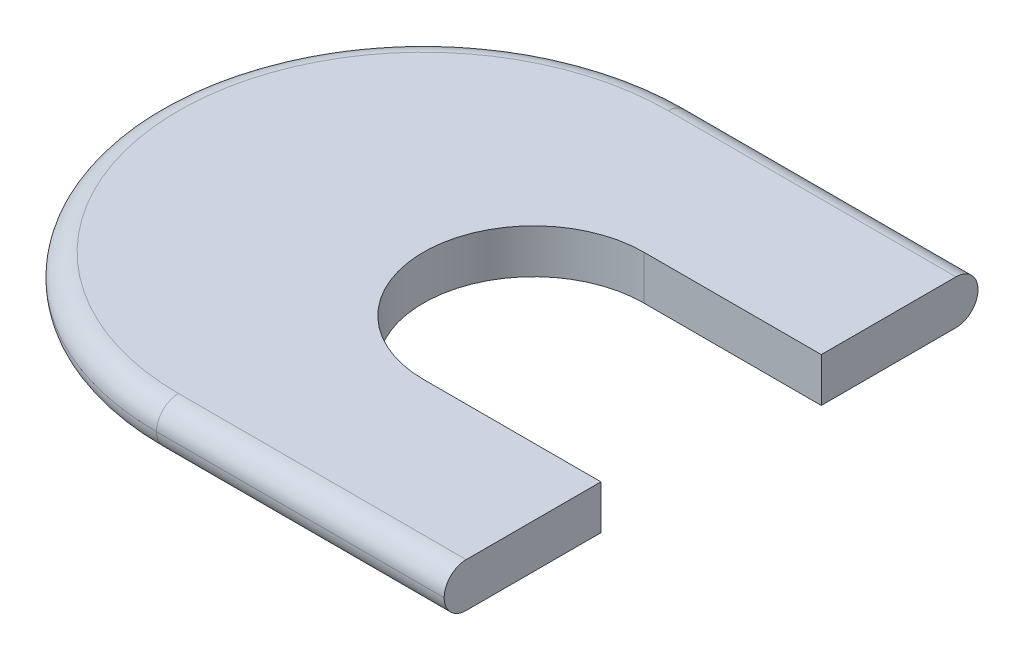
ISO-10303-21;
HEADER;
FILE_DESCRIPTION(('STEP AP214'),'2;1');
FILE_NAME('part.step','',(''),(''),'','','');
FILE_SCHEMA(('AUTOMOTIVE_DESIGN { 1 0 10303 214 1 1 1 1 }'));
ENDSEC;
DATA;
#1=APPLICATION_CONTEXT('core data for automotive mechanical design processes');
#2=APPLICATION_PROTOCOL_DEFINITION('international standard','automotive_design',2000,#1);
#3=PRODUCT_CONTEXT('',#1,'mechanical');
#4=PRODUCT('Part','Part','',(#3));
#5=PRODUCT_RELATED_PRODUCT_CATEGORY('part','',(#4));
#6=PRODUCT_DEFINITION_FORMATION('','',#4);
#7=PRODUCT_DEFINITION_CONTEXT('part definition',#1,'design');
#8=PRODUCT_DEFINITION('design','',#6,#7);
#9=PRODUCT_DEFINITION_SHAPE('','',#8);
#10=(LENGTH_UNIT() NAMED_UNIT(*) SI_UNIT(.MILLI.,.METRE.));
#11=(NAMED_UNIT(*) PLANE_ANGLE_UNIT() SI_UNIT($,.RADIAN.));
#12=(NAMED_UNIT(*) SI_UNIT($,.STERADIAN.) SOLID_ANGLE_UNIT());
#13=UNCERTAINTY_MEASURE_WITH_UNIT(LENGTH_MEASURE(1.E-05),#10,'distance_accuracy_value','');
#14=(GEOMETRIC_REPRESENTATION_CONTEXT(3) GLOBAL_UNCERTAINTY_ASSIGNED_CONTEXT((#13)) GLOBAL_UNIT_ASSIGNED_CONTEXT((#10,
#11,#12)) REPRESENTATION_CONTEXT('',''));
#15=CARTESIAN_POINT('',(0.,0.,0.));
#16=DIRECTION('',(0.,0.,1.));
#17=DIRECTION('',(1.,0.,0.));
#18=AXIS2_PLACEMENT_3D('',#15,#16,#17);
#19=CARTESIAN_POINT('',(0.,1.,0.));
#20=DIRECTION('',(0.,-1.,0.));
#21=DIRECTION('',(0.,0.,-1.));
#22=AXIS2_PLACEMENT_3D('',#19,#20,#21);
#23=CYLINDRICAL_SURFACE('',#22,2.5);
#24=CARTESIAN_POINT('',(0.,0.,0.));
#25=DIRECTION('',(0.,-1.,0.));
#26=DIRECTION('',(0.,0.,1.));
#27=AXIS2_PLACEMENT_3D('',#24,#25,#26);
#28=CIRCLE('',#27,2.5);
#29=CARTESIAN_POINT('',(0.,0.,2.5));
#30=VERTEX_POINT('',#29);
#31=CARTESIAN_POINT('',(0.,0.,-2.5));
#32=VERTEX_POINT('',#31);
#33=EDGE_CURVE('E183',#30,#32,#28,.T.);
#34=ORIENTED_EDGE('',*,*,#33,.T.);
#35=DIRECTION('',(0.,-1.,0.));
#36=VECTOR('',#35,1.);
#37=CARTESIAN_POINT('',(0.,1.,-2.5));
#38=LINE('',#37,#36);
#39=CARTESIAN_POINT('',(0.,1.,-2.5));
#40=VERTEX_POINT('',#39);
#41=EDGE_CURVE('E218',#40,#32,#38,.T.);
#42=ORIENTED_EDGE('',*,*,#41,.F.);
#43=CARTESIAN_POINT('',(0.,1.,0.));
#44=DIRECTION('',(0.,-1.,0.));
#45=DIRECTION('',(0.,0.,1.));
#46=AXIS2_PLACEMENT_3D('',#43,#44,#45);
#47=CIRCLE('',#46,2.5);
#48=CARTESIAN_POINT('',(0.,1.,2.5));
#49=VERTEX_POINT('',#48);
#50=EDGE_CURVE('E206',#49,#40,#47,.T.);
#51=ORIENTED_EDGE('',*,*,#50,.F.);
#52=DIRECTION('',(0.,-1.,0.));
#53=VECTOR('',#52,1.);
#54=CARTESIAN_POINT('',(0.,1.,2.5));
#55=LINE('',#54,#53);
#56=EDGE_CURVE('E207',#49,#30,#55,.T.);
#57=ORIENTED_EDGE('',*,*,#56,.T.);
#58=EDGE_LOOP('',(#34,#42,#51,#57));
#59=FACE_BOUND('',#58,.T.);
#60=ADVANCED_FACE('F42',(#59),#23,.F.);
#61=CARTESIAN_POINT('',(0.,1.,-2.5));
#62=DIRECTION('',(0.,0.,-1.));
#63=DIRECTION('',(-1.,0.,0.));
#64=AXIS2_PLACEMENT_3D('',#61,#62,#63);
#65=PLANE('',#64);
#66=DIRECTION('',(1.,0.,0.));
#67=VECTOR('',#66,1.);
#68=CARTESIAN_POINT('',(0.,0.,-2.5));
#69=LINE('',#68,#67);
#70=CARTESIAN_POINT('',(4.02649188596562,0.,-2.5));
#71=VERTEX_POINT('',#70);
#72=EDGE_CURVE('E86',#32,#71,#69,.T.);
#73=ORIENTED_EDGE('',*,*,#72,.T.);
#74=DIRECTION('',(0.,-1.,0.));
#75=VECTOR('',#74,1.);
#76=CARTESIAN_POINT('',(4.02649188596562,1.,-2.5));
#77=LINE('',#76,#75);
#78=CARTESIAN_POINT('',(4.02649188596562,1.,-2.5));
#79=VERTEX_POINT('',#78);
#80=EDGE_CURVE('E214',#79,#71,#77,.T.);
#81=ORIENTED_EDGE('',*,*,#80,.F.);
#82=DIRECTION('',(1.,0.,0.));
#83=VECTOR('',#82,1.);
#84=CARTESIAN_POINT('',(0.,1.,-2.5));
#85=LINE('',#84,#83);
#86=EDGE_CURVE('E248',#40,#79,#85,.T.);
#87=ORIENTED_EDGE('',*,*,#86,.F.);
#88=ORIENTED_EDGE('',*,*,#41,.T.);
#89=EDGE_LOOP('',(#73,#81,#87,#88));
#90=FACE_BOUND('',#89,.T.);
#91=ADVANCED_FACE('F260',(#90),#65,.F.);
#92=CARTESIAN_POINT('',(4.02649188596562,1.,-2.5));
#93=DIRECTION('',(-1.,0.,0.));
#94=DIRECTION('',(0.,0.,1.));
#95=AXIS2_PLACEMENT_3D('',#92,#93,#94);
#96=PLANE('',#95);
#97=DIRECTION('',(0.,0.,-1.));
#98=VECTOR('',#97,1.);
#99=CARTESIAN_POINT('',(4.02649188596562,0.,-2.5));
#100=LINE('',#99,#98);
#101=CARTESIAN_POINT('',(4.02649188596562,0.,-5.55571493406809));
#102=VERTEX_POINT('',#101);
#103=EDGE_CURVE('E191',#71,#102,#100,.T.);
#104=ORIENTED_EDGE('',*,*,#103,.T.);
#105=CARTESIAN_POINT('',(4.02649188596562,0.5,-5.55571493406809));
#106=DIRECTION('',(-1.,0.,0.));
#107=DIRECTION('',(0.,0.,1.));
#108=AXIS2_PLACEMENT_3D('',#105,#106,#107);
#109=CIRCLE('',#108,0.5);
#110=CARTESIAN_POINT('',(4.02649188596562,0.5,-6.0557149340681));
#111=VERTEX_POINT('',#110);
#112=EDGE_CURVE('E132',#102,#111,#109,.F.);
#113=ORIENTED_EDGE('',*,*,#112,.T.);
#114=CARTESIAN_POINT('',(4.02649188596562,0.5,-5.55571493406809));
#115=DIRECTION('',(-1.,0.,0.));
#116=DIRECTION('',(0.,0.,1.));
#117=AXIS2_PLACEMENT_3D('',#114,#115,#116);
#118=CIRCLE('',#117,0.5);
#119=CARTESIAN_POINT('',(4.02649188596562,1.,-5.55571493406809));
#120=VERTEX_POINT('',#119);
#121=EDGE_CURVE('E170',#111,#120,#118,.F.);
#122=ORIENTED_EDGE('',*,*,#121,.T.);
#123=DIRECTION('',(0.,0.,-1.));
#124=VECTOR('',#123,1.);
#125=CARTESIAN_POINT('',(4.02649188596562,1.,-2.5));
#126=LINE('',#125,#124);
#127=EDGE_CURVE('E246',#79,#120,#126,.T.);
#128=ORIENTED_EDGE('',*,*,#127,.F.);
#129=ORIENTED_EDGE('',*,*,#80,.T.);
#130=EDGE_LOOP('',(#104,#113,#122,#128,#129));
#131=FACE_BOUND('',#130,.T.);
#132=ADVANCED_FACE('F230',(#131),#96,.F.);
#133=CARTESIAN_POINT('',(4.02649188596562,1.,2.5));
#134=DIRECTION('',(-1.,0.,0.));
#135=DIRECTION('',(0.,0.,1.));
#136=AXIS2_PLACEMENT_3D('',#133,#134,#135);
#137=PLANE('',#136);
#138=CARTESIAN_POINT('',(4.02649188596562,0.5,5.55571493406809));
#139=DIRECTION('',(-1.,0.,0.));
#140=DIRECTION('',(0.,0.,1.));
#141=AXIS2_PLACEMENT_3D('',#138,#139,#140);
#142=CIRCLE('',#141,0.5);
#143=CARTESIAN_POINT('',(4.02649188596562,1.,5.55571493406809));
#144=VERTEX_POINT('',#143);
#145=CARTESIAN_POINT('',(4.02649188596562,0.5,6.0557149340681));
#146=VERTEX_POINT('',#145);
#147=EDGE_CURVE('E123',#144,#146,#142,.F.);
#148=ORIENTED_EDGE('',*,*,#147,.T.);
#149=CARTESIAN_POINT('',(4.02649188596562,0.5,5.55571493406809));
#150=DIRECTION('',(-1.,0.,0.));
#151=DIRECTION('',(0.,0.,1.));
#152=AXIS2_PLACEMENT_3D('',#149,#150,#151);
#153=CIRCLE('',#152,0.5);
#154=CARTESIAN_POINT('',(4.02649188596562,0.,5.55571493406809));
#155=VERTEX_POINT('',#154);
#156=EDGE_CURVE('E126',#146,#155,#153,.F.);
#157=ORIENTED_EDGE('',*,*,#156,.T.);
#158=DIRECTION('',(0.,0.,-1.));
#159=VECTOR('',#158,1.);
#160=CARTESIAN_POINT('',(4.02649188596562,0.,2.5));
#161=LINE('',#160,#159);
#162=CARTESIAN_POINT('',(4.02649188596562,0.,2.5));
#163=VERTEX_POINT('',#162);
#164=EDGE_CURVE('E200',#155,#163,#161,.T.);
#165=ORIENTED_EDGE('',*,*,#164,.T.);
#166=DIRECTION('',(0.,-1.,0.));
#167=VECTOR('',#166,1.);
#168=CARTESIAN_POINT('',(4.02649188596562,1.,2.5));
#169=LINE('',#168,#167);
#170=CARTESIAN_POINT('',(4.02649188596562,1.,2.5));
#171=VERTEX_POINT('',#170);
#172=EDGE_CURVE('E210',#171,#163,#169,.T.);
#173=ORIENTED_EDGE('',*,*,#172,.F.);
#174=DIRECTION('',(0.,0.,-1.));
#175=VECTOR('',#174,1.);
#176=CARTESIAN_POINT('',(4.02649188596562,1.,2.5));
#177=LINE('',#176,#175);
#178=EDGE_CURVE('E130',#144,#171,#177,.T.);
#179=ORIENTED_EDGE('',*,*,#178,.F.);
#180=EDGE_LOOP('',(#148,#157,#165,#173,#179));
#181=FACE_BOUND('',#180,.T.);
#182=ADVANCED_FACE('F124',(#181),#137,.F.);
#183=CARTESIAN_POINT('',(0.,1.,2.5));
#184=DIRECTION('',(0.,0.,1.));
#185=DIRECTION('',(1.,0.,0.));
#186=AXIS2_PLACEMENT_3D('',#183,#184,#185);
#187=PLANE('',#186);
#188=DIRECTION('',(-1.,0.,0.));
#189=VECTOR('',#188,1.);
#190=CARTESIAN_POINT('',(0.,0.,2.5));
#191=LINE('',#190,#189);
#192=EDGE_CURVE('E203',#163,#30,#191,.T.);
#193=ORIENTED_EDGE('',*,*,#192,.T.);
#194=ORIENTED_EDGE('',*,*,#56,.F.);
#195=DIRECTION('',(-1.,0.,0.));
#196=VECTOR('',#195,1.);
#197=CARTESIAN_POINT('',(0.,1.,2.5));
#198=LINE('',#197,#196);
#199=EDGE_CURVE('E194',#171,#49,#198,.T.);
#200=ORIENTED_EDGE('',*,*,#199,.F.);
#201=ORIENTED_EDGE('',*,*,#172,.T.);
#202=EDGE_LOOP('',(#193,#194,#200,#201));
#203=FACE_BOUND('',#202,.T.);
#204=ADVANCED_FACE('F238',(#203),#187,.F.);
#205=CARTESIAN_POINT('',(0.,1.,0.));
#206=DIRECTION('',(0.,1.,0.));
#207=DIRECTION('',(0.,0.,1.));
#208=AXIS2_PLACEMENT_3D('',#205,#206,#207);
#209=PLANE('',#208);
#210=ORIENTED_EDGE('',*,*,#127,.T.);
#211=DIRECTION('',(-1.,0.,0.));
#212=VECTOR('',#211,1.);
#213=CARTESIAN_POINT('',(-2.5,1.,-5.55571493406809));
#214=LINE('',#213,#212);
#215=CARTESIAN_POINT('',(-2.5,1.,-5.55571493406809));
#216=VERTEX_POINT('',#215);
#217=EDGE_CURVE('E11',#120,#216,#214,.T.);
#218=ORIENTED_EDGE('',*,*,#217,.T.);
#219=CARTESIAN_POINT('',(-2.5,1.,0.));
#220=DIRECTION('',(0.,1.,0.));
#221=DIRECTION('',(0.,0.,1.));
#222=AXIS2_PLACEMENT_3D('',#219,#220,#221);
#223=CIRCLE('',#222,5.55571493406809);
#224=CARTESIAN_POINT('',(-2.5,1.,5.55571493406809));
#225=VERTEX_POINT('',#224);
#226=EDGE_CURVE('E61',#216,#225,#223,.T.);
#227=ORIENTED_EDGE('',*,*,#226,.T.);
#228=DIRECTION('',(1.,0.,0.));
#229=VECTOR('',#228,1.);
#230=CARTESIAN_POINT('',(4.02649188596562,1.,5.55571493406809));
#231=LINE('',#230,#229);
#232=EDGE_CURVE('E53',#225,#144,#231,.T.);
#233=ORIENTED_EDGE('',*,*,#232,.T.);
#234=ORIENTED_EDGE('',*,*,#178,.T.);
#235=ORIENTED_EDGE('',*,*,#199,.T.);
#236=ORIENTED_EDGE('',*,*,#50,.T.);
#237=ORIENTED_EDGE('',*,*,#86,.T.);
#238=EDGE_LOOP('',(#210,#218,#227,#233,#234,#235,#236,#237));
#239=FACE_BOUND('',#238,.T.);
#240=ADVANCED_FACE('F255',(#239),#209,.T.);
#241=CARTESIAN_POINT('',(0.,0.,0.));
#242=DIRECTION('',(0.,1.,0.));
#243=DIRECTION('',(0.,0.,1.));
#244=AXIS2_PLACEMENT_3D('',#241,#242,#243);
#245=PLANE('',#244);
#246=CARTESIAN_POINT('',(-2.5,0.,0.));
#247=DIRECTION('',(0.,1.,0.));
#248=DIRECTION('',(0.,0.,1.));
#249=AXIS2_PLACEMENT_3D('',#246,#247,#248);
#250=CIRCLE('',#249,5.55571493406809);
#251=CARTESIAN_POINT('',(-2.5,0.,5.55571493406809));
#252=VERTEX_POINT('',#251);
#253=CARTESIAN_POINT('',(-2.5,0.,-5.55571493406809));
#254=VERTEX_POINT('',#253);
#255=EDGE_CURVE('E180',#252,#254,#250,.F.);
#256=ORIENTED_EDGE('',*,*,#255,.T.);
#257=DIRECTION('',(-1.,0.,0.));
#258=VECTOR('',#257,1.);
#259=CARTESIAN_POINT('',(0.,0.,-5.55571493406809));
#260=LINE('',#259,#258);
#261=EDGE_CURVE('E176',#254,#102,#260,.F.);
#262=ORIENTED_EDGE('',*,*,#261,.T.);
#263=ORIENTED_EDGE('',*,*,#103,.F.);
#264=ORIENTED_EDGE('',*,*,#72,.F.);
#265=ORIENTED_EDGE('',*,*,#33,.F.);
#266=ORIENTED_EDGE('',*,*,#192,.F.);
#267=ORIENTED_EDGE('',*,*,#164,.F.);
#268=DIRECTION('',(1.,0.,0.));
#269=VECTOR('',#268,1.);
#270=CARTESIAN_POINT('',(0.,0.,5.55571493406809));
#271=LINE('',#270,#269);
#272=EDGE_CURVE('E140',#155,#252,#271,.F.);
#273=ORIENTED_EDGE('',*,*,#272,.T.);
#274=EDGE_LOOP('',(#256,#262,#263,#264,#265,#266,#267,#273));
#275=FACE_BOUND('',#274,.T.);
#276=ADVANCED_FACE('F233',(#275),#245,.F.);
#277=CARTESIAN_POINT('',(0.,0.5,5.55571493406809));
#278=DIRECTION('',(-1.,0.,0.));
#279=DIRECTION('',(0.,0.,1.));
#280=AXIS2_PLACEMENT_3D('',#277,#278,#279);
#281=CYLINDRICAL_SURFACE('',#280,0.5);
#282=ORIENTED_EDGE('',*,*,#147,.F.);
#283=ORIENTED_EDGE('',*,*,#232,.F.);
#284=CARTESIAN_POINT('',(-2.5,0.5,5.55571493406809));
#285=DIRECTION('',(-1.,0.,0.));
#286=DIRECTION('',(0.,0.,1.));
#287=AXIS2_PLACEMENT_3D('',#284,#285,#286);
#288=CIRCLE('',#287,0.5);
#289=CARTESIAN_POINT('',(-2.5,0.5,6.0557149340681));
#290=VERTEX_POINT('',#289);
#291=EDGE_CURVE('E46',#290,#225,#288,.T.);
#292=ORIENTED_EDGE('',*,*,#291,.F.);
#293=DIRECTION('',(1.,0.,0.));
#294=VECTOR('',#293,1.);
#295=CARTESIAN_POINT('',(-2.5,0.5,6.0557149340681));
#296=LINE('',#295,#294);
#297=EDGE_CURVE('E134',#146,#290,#296,.F.);
#298=ORIENTED_EDGE('',*,*,#297,.F.);
#299=EDGE_LOOP('',(#282,#283,#292,#298));
#300=FACE_BOUND('',#299,.T.);
#301=ADVANCED_FACE('F44',(#300),#281,.T.);
#302=CARTESIAN_POINT('',(-2.5,0.5,0.));
#303=DIRECTION('',(0.,1.,0.));
#304=DIRECTION('',(0.,0.,1.));
#305=AXIS2_PLACEMENT_3D('',#302,#303,#304);
#306=TOROIDAL_SURFACE('',#305,5.55571493406809,0.5);
#307=ORIENTED_EDGE('',*,*,#291,.T.);
#308=ORIENTED_EDGE('',*,*,#226,.F.);
#309=CARTESIAN_POINT('',(-2.5,0.5,-5.55571493406809));
#310=DIRECTION('',(1.,0.,0.));
#311=DIRECTION('',(0.,0.,-1.));
#312=AXIS2_PLACEMENT_3D('',#309,#310,#311);
#313=CIRCLE('',#312,0.5);
#314=CARTESIAN_POINT('',(-2.5,0.5,-6.0557149340681));
#315=VERTEX_POINT('',#314);
#316=EDGE_CURVE('E71',#315,#216,#313,.T.);
#317=ORIENTED_EDGE('',*,*,#316,.F.);
#318=CARTESIAN_POINT('',(-2.5,0.5,0.));
#319=DIRECTION('',(0.,1.,0.));
#320=DIRECTION('',(0.,0.,1.));
#321=AXIS2_PLACEMENT_3D('',#318,#319,#320);
#322=CIRCLE('',#321,6.0557149340681);
#323=EDGE_CURVE('E161',#290,#315,#322,.F.);
#324=ORIENTED_EDGE('',*,*,#323,.F.);
#325=EDGE_LOOP('',(#307,#308,#317,#324));
#326=FACE_BOUND('',#325,.T.);
#327=ADVANCED_FACE('F181',(#326),#306,.T.);
#328=CARTESIAN_POINT('',(4.02649188596562,0.5,5.55571493406809));
#329=DIRECTION('',(1.,0.,0.));
#330=DIRECTION('',(0.,0.,-1.));
#331=AXIS2_PLACEMENT_3D('',#328,#329,#330);
#332=CYLINDRICAL_SURFACE('',#331,0.5);
#333=ORIENTED_EDGE('',*,*,#156,.F.);
#334=ORIENTED_EDGE('',*,*,#297,.T.);
#335=CARTESIAN_POINT('',(-2.5,0.5,5.55571493406809));
#336=DIRECTION('',(-1.,0.,0.));
#337=DIRECTION('',(0.,0.,1.));
#338=AXIS2_PLACEMENT_3D('',#335,#336,#337);
#339=CIRCLE('',#338,0.5);
#340=EDGE_CURVE('E157',#252,#290,#339,.T.);
#341=ORIENTED_EDGE('',*,*,#340,.F.);
#342=ORIENTED_EDGE('',*,*,#272,.F.);
#343=EDGE_LOOP('',(#333,#334,#341,#342));
#344=FACE_BOUND('',#343,.T.);
#345=ADVANCED_FACE('F139',(#344),#332,.T.);
#346=CARTESIAN_POINT('',(0.,0.5,-5.55571493406809));
#347=DIRECTION('',(1.,0.,0.));
#348=DIRECTION('',(0.,0.,-1.));
#349=AXIS2_PLACEMENT_3D('',#346,#347,#348);
#350=CYLINDRICAL_SURFACE('',#349,0.5);
#351=ORIENTED_EDGE('',*,*,#217,.F.);
#352=ORIENTED_EDGE('',*,*,#121,.F.);
#353=DIRECTION('',(-1.,0.,0.));
#354=VECTOR('',#353,1.);
#355=CARTESIAN_POINT('',(4.02649188596562,0.5,-6.0557149340681));
#356=LINE('',#355,#354);
#357=EDGE_CURVE('E153',#315,#111,#356,.F.);
#358=ORIENTED_EDGE('',*,*,#357,.F.);
#359=ORIENTED_EDGE('',*,*,#316,.T.);
#360=EDGE_LOOP('',(#351,#352,#358,#359));
#361=FACE_BOUND('',#360,.T.);
#362=ADVANCED_FACE('F168',(#361),#350,.T.);
#363=CARTESIAN_POINT('',(-2.5,0.5,0.));
#364=DIRECTION('',(0.,1.,0.));
#365=DIRECTION('',(0.,0.,1.));
#366=AXIS2_PLACEMENT_3D('',#363,#364,#365);
#367=TOROIDAL_SURFACE('',#366,5.55571493406809,0.5);
#368=ORIENTED_EDGE('',*,*,#340,.T.);
#369=ORIENTED_EDGE('',*,*,#323,.T.);
#370=CARTESIAN_POINT('',(-2.5,0.5,-5.55571493406809));
#371=DIRECTION('',(1.,0.,0.));
#372=DIRECTION('',(0.,0.,-1.));
#373=AXIS2_PLACEMENT_3D('',#370,#371,#372);
#374=CIRCLE('',#373,0.5);
#375=EDGE_CURVE('E149',#254,#315,#374,.T.);
#376=ORIENTED_EDGE('',*,*,#375,.F.);
#377=ORIENTED_EDGE('',*,*,#255,.F.);
#378=EDGE_LOOP('',(#368,#369,#376,#377));
#379=FACE_BOUND('',#378,.T.);
#380=ADVANCED_FACE('F179',(#379),#367,.T.);
#381=CARTESIAN_POINT('',(4.02649188596562,0.5,-5.55571493406809));
#382=DIRECTION('',(-1.,0.,0.));
#383=DIRECTION('',(0.,0.,1.));
#384=AXIS2_PLACEMENT_3D('',#381,#382,#383);
#385=CYLINDRICAL_SURFACE('',#384,0.5);
#386=ORIENTED_EDGE('',*,*,#112,.F.);
#387=ORIENTED_EDGE('',*,*,#261,.F.);
#388=ORIENTED_EDGE('',*,*,#375,.T.);
#389=ORIENTED_EDGE('',*,*,#357,.T.);
#390=EDGE_LOOP('',(#386,#387,#388,#389));
#391=FACE_BOUND('',#390,.T.);
#392=ADVANCED_FACE('F174',(#391),#385,.T.);
#393=CLOSED_SHELL('',(#60,#91,#132,#182,#204,#240,#276,#301,#327,#345,#362,#380,#392));
#394=MANIFOLD_SOLID_BREP('B2',#393);
#395=ADVANCED_BREP_SHAPE_REPRESENTATION('',(#18,#394),#14);
#396=SHAPE_DEFINITION_REPRESENTATION(#9,#395);
ENDSEC;
END-ISO-10303-21;
